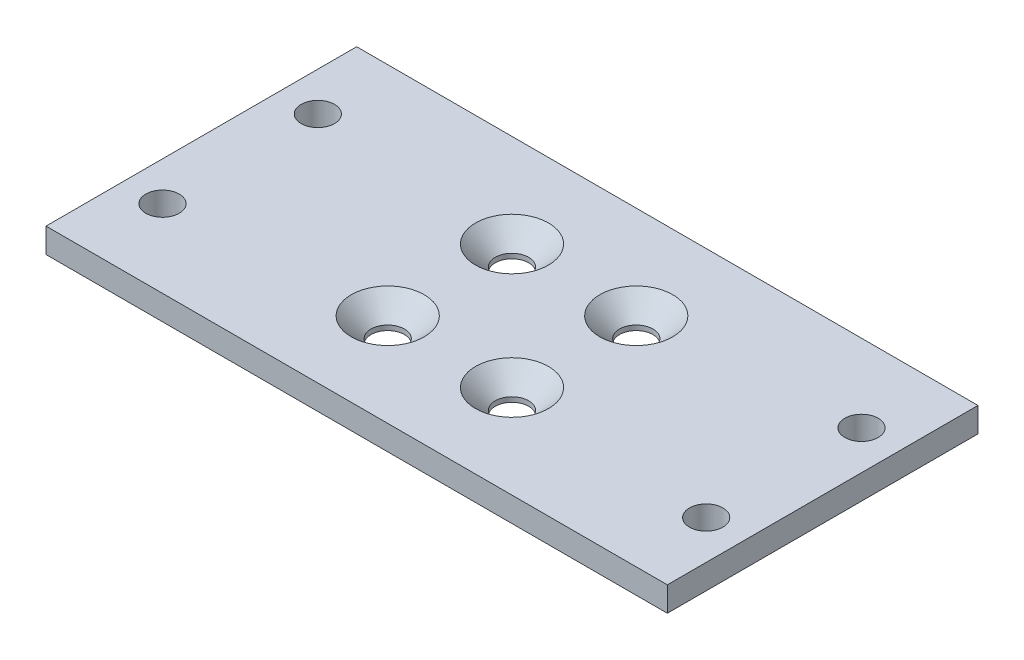
ISO-10303-21;
HEADER;
FILE_DESCRIPTION(('STEP AP214'),'2;1');
FILE_NAME('part.step','',(''),(''),'','','');
FILE_SCHEMA(('AUTOMOTIVE_DESIGN { 1 0 10303 214 1 1 1 1 }'));
ENDSEC;
DATA;
#1=APPLICATION_CONTEXT('core data for automotive mechanical design processes');
#2=APPLICATION_PROTOCOL_DEFINITION('international standard','automotive_design',2000,#1);
#3=PRODUCT_CONTEXT('',#1,'mechanical');
#4=PRODUCT('Part','Part','',(#3));
#5=PRODUCT_RELATED_PRODUCT_CATEGORY('part','',(#4));
#6=PRODUCT_DEFINITION_FORMATION('','',#4);
#7=PRODUCT_DEFINITION_CONTEXT('part definition',#1,'design');
#8=PRODUCT_DEFINITION('design','',#6,#7);
#9=PRODUCT_DEFINITION_SHAPE('','',#8);
#10=(LENGTH_UNIT() NAMED_UNIT(*) SI_UNIT(.MILLI.,.METRE.));
#11=(NAMED_UNIT(*) PLANE_ANGLE_UNIT() SI_UNIT($,.RADIAN.));
#12=(NAMED_UNIT(*) SI_UNIT($,.STERADIAN.) SOLID_ANGLE_UNIT());
#13=UNCERTAINTY_MEASURE_WITH_UNIT(LENGTH_MEASURE(1.E-05),#10,'distance_accuracy_value','');
#14=(GEOMETRIC_REPRESENTATION_CONTEXT(3) GLOBAL_UNCERTAINTY_ASSIGNED_CONTEXT((#13)) GLOBAL_UNIT_ASSIGNED_CONTEXT((#10,
#11,#12)) REPRESENTATION_CONTEXT('',''));
#15=CARTESIAN_POINT('',(0.,0.,0.));
#16=DIRECTION('',(0.,0.,1.));
#17=DIRECTION('',(1.,0.,0.));
#18=AXIS2_PLACEMENT_3D('',#15,#16,#17);
#19=CARTESIAN_POINT('',(0.,3.175,0.));
#20=DIRECTION('',(0.,-1.,0.));
#21=DIRECTION('',(0.,0.,-1.));
#22=AXIS2_PLACEMENT_3D('',#19,#20,#21);
#23=PLANE('',#22);
#24=CARTESIAN_POINT('',(-8.,3.175,-8.));
#25=DIRECTION('',(0.,1.,0.));
#26=DIRECTION('',(0.,0.,1.));
#27=AXIS2_PLACEMENT_3D('',#24,#25,#26);
#28=CIRCLE('',#27,4.7);
#29=CARTESIAN_POINT('',(-8.,3.175,-3.3));
#30=VERTEX_POINT('',#29);
#31=EDGE_CURVE('E174',#30,#30,#28,.T.);
#32=ORIENTED_EDGE('',*,*,#31,.F.);
#33=EDGE_LOOP('',(#32));
#34=FACE_BOUND('',#33,.T.);
#35=CARTESIAN_POINT('',(8.00000000000003,3.175,-7.99999999999997));
#36=DIRECTION('',(0.,1.,0.));
#37=DIRECTION('',(0.,0.,1.));
#38=AXIS2_PLACEMENT_3D('',#35,#36,#37);
#39=CIRCLE('',#38,4.7);
#40=CARTESIAN_POINT('',(8.00000000000003,3.175,-3.29999999999997));
#41=VERTEX_POINT('',#40);
#42=EDGE_CURVE('E165',#41,#41,#39,.T.);
#43=ORIENTED_EDGE('',*,*,#42,.F.);
#44=EDGE_LOOP('',(#43));
#45=FACE_BOUND('',#44,.T.);
#46=CARTESIAN_POINT('',(7.99999999999994,3.175,8.00000000000006));
#47=DIRECTION('',(0.,1.,0.));
#48=DIRECTION('',(0.,0.,1.));
#49=AXIS2_PLACEMENT_3D('',#46,#47,#48);
#50=CIRCLE('',#49,4.7);
#51=CARTESIAN_POINT('',(7.99999999999994,3.175,12.7000000000001));
#52=VERTEX_POINT('',#51);
#53=EDGE_CURVE('E156',#52,#52,#50,.T.);
#54=ORIENTED_EDGE('',*,*,#53,.F.);
#55=EDGE_LOOP('',(#54));
#56=FACE_BOUND('',#55,.T.);
#57=CARTESIAN_POINT('',(-8.00000000000008,3.175,7.99999999999992));
#58=DIRECTION('',(0.,1.,0.));
#59=DIRECTION('',(0.,0.,1.));
#60=AXIS2_PLACEMENT_3D('',#57,#58,#59);
#61=CIRCLE('',#60,4.7);
#62=CARTESIAN_POINT('',(-8.00000000000008,3.175,12.6999999999999));
#63=VERTEX_POINT('',#62);
#64=EDGE_CURVE('E147',#63,#63,#61,.T.);
#65=ORIENTED_EDGE('',*,*,#64,.F.);
#66=EDGE_LOOP('',(#65));
#67=FACE_BOUND('',#66,.T.);
#68=CARTESIAN_POINT('',(-35.,3.175,-10.));
#69=DIRECTION('',(0.,1.,0.));
#70=DIRECTION('',(0.,0.,1.));
#71=AXIS2_PLACEMENT_3D('',#68,#69,#70);
#72=CIRCLE('',#71,2.15);
#73=CARTESIAN_POINT('',(-35.,3.175,-7.85));
#74=VERTEX_POINT('',#73);
#75=EDGE_CURVE('E138',#74,#74,#72,.T.);
#76=ORIENTED_EDGE('',*,*,#75,.F.);
#77=EDGE_LOOP('',(#76));
#78=FACE_BOUND('',#77,.T.);
#79=CARTESIAN_POINT('',(35.,3.175,-9.99999999999998));
#80=DIRECTION('',(0.,1.,0.));
#81=DIRECTION('',(0.,0.,1.));
#82=AXIS2_PLACEMENT_3D('',#79,#80,#81);
#83=CIRCLE('',#82,2.15);
#84=CARTESIAN_POINT('',(35.,3.175,-7.84999999999998));
#85=VERTEX_POINT('',#84);
#86=EDGE_CURVE('E132',#85,#85,#83,.T.);
#87=ORIENTED_EDGE('',*,*,#86,.F.);
#88=EDGE_LOOP('',(#87));
#89=FACE_BOUND('',#88,.T.);
#90=CARTESIAN_POINT('',(-35.,3.175,10.));
#91=DIRECTION('',(0.,1.,0.));
#92=DIRECTION('',(0.,0.,1.));
#93=AXIS2_PLACEMENT_3D('',#90,#91,#92);
#94=CIRCLE('',#93,2.15);
#95=CARTESIAN_POINT('',(-35.,3.175,12.15));
#96=VERTEX_POINT('',#95);
#97=EDGE_CURVE('E120',#96,#96,#94,.T.);
#98=ORIENTED_EDGE('',*,*,#97,.F.);
#99=EDGE_LOOP('',(#98));
#100=FACE_BOUND('',#99,.T.);
#101=DIRECTION('',(0.,0.,-1.));
#102=VECTOR('',#101,1.);
#103=CARTESIAN_POINT('',(40.,3.175,20.));
#104=LINE('',#103,#102);
#105=CARTESIAN_POINT('',(40.,3.175,20.));
#106=VERTEX_POINT('',#105);
#107=CARTESIAN_POINT('',(40.,3.175,-20.));
#108=VERTEX_POINT('',#107);
#109=EDGE_CURVE('E91',#106,#108,#104,.T.);
#110=ORIENTED_EDGE('',*,*,#109,.T.);
#111=DIRECTION('',(-1.,0.,0.));
#112=VECTOR('',#111,1.);
#113=CARTESIAN_POINT('',(-40.,3.175,-20.));
#114=LINE('',#113,#112);
#115=CARTESIAN_POINT('',(-40.,3.175,-20.));
#116=VERTEX_POINT('',#115);
#117=EDGE_CURVE('E86',#108,#116,#114,.T.);
#118=ORIENTED_EDGE('',*,*,#117,.T.);
#119=DIRECTION('',(0.,0.,1.));
#120=VECTOR('',#119,1.);
#121=CARTESIAN_POINT('',(-40.,3.175,20.));
#122=LINE('',#121,#120);
#123=CARTESIAN_POINT('',(-40.,3.175,20.));
#124=VERTEX_POINT('',#123);
#125=EDGE_CURVE('E89',#116,#124,#122,.T.);
#126=ORIENTED_EDGE('',*,*,#125,.T.);
#127=DIRECTION('',(1.,0.,0.));
#128=VECTOR('',#127,1.);
#129=CARTESIAN_POINT('',(-40.,3.175,20.));
#130=LINE('',#129,#128);
#131=EDGE_CURVE('E56',#124,#106,#130,.T.);
#132=ORIENTED_EDGE('',*,*,#131,.T.);
#133=EDGE_LOOP('',(#110,#118,#126,#132));
#134=FACE_BOUND('',#133,.T.);
#135=CARTESIAN_POINT('',(35.,3.175,9.99999999999998));
#136=DIRECTION('',(0.,1.,0.));
#137=DIRECTION('',(0.,0.,1.));
#138=AXIS2_PLACEMENT_3D('',#135,#136,#137);
#139=CIRCLE('',#138,2.15);
#140=CARTESIAN_POINT('',(35.,3.175,12.15));
#141=VERTEX_POINT('',#140);
#142=EDGE_CURVE('E126',#141,#141,#139,.T.);
#143=ORIENTED_EDGE('',*,*,#142,.F.);
#144=EDGE_LOOP('',(#143));
#145=FACE_BOUND('',#144,.T.);
#146=ADVANCED_FACE('F39',(#34,#45,#56,#67,#78,#89,#100,#134,#145),#23,.F.);
#147=CARTESIAN_POINT('',(0.,0.,0.));
#148=DIRECTION('',(0.,-1.,0.));
#149=DIRECTION('',(0.,0.,-1.));
#150=AXIS2_PLACEMENT_3D('',#147,#148,#149);
#151=PLANE('',#150);
#152=CARTESIAN_POINT('',(-8.,0.,-8.));
#153=DIRECTION('',(0.,1.,0.));
#154=DIRECTION('',(0.,0.,1.));
#155=AXIS2_PLACEMENT_3D('',#152,#153,#154);
#156=CIRCLE('',#155,2.15);
#157=CARTESIAN_POINT('',(-8.,0.,-5.85));
#158=VERTEX_POINT('',#157);
#159=EDGE_CURVE('E168',#158,#158,#156,.T.);
#160=ORIENTED_EDGE('',*,*,#159,.T.);
#161=EDGE_LOOP('',(#160));
#162=FACE_BOUND('',#161,.T.);
#163=CARTESIAN_POINT('',(8.00000000000003,0.,-7.99999999999997));
#164=DIRECTION('',(0.,1.,0.));
#165=DIRECTION('',(0.,0.,1.));
#166=AXIS2_PLACEMENT_3D('',#163,#164,#165);
#167=CIRCLE('',#166,2.15);
#168=CARTESIAN_POINT('',(8.00000000000003,0.,-5.84999999999997));
#169=VERTEX_POINT('',#168);
#170=EDGE_CURVE('E159',#169,#169,#167,.T.);
#171=ORIENTED_EDGE('',*,*,#170,.T.);
#172=EDGE_LOOP('',(#171));
#173=FACE_BOUND('',#172,.T.);
#174=CARTESIAN_POINT('',(7.99999999999994,0.,8.00000000000006));
#175=DIRECTION('',(0.,1.,0.));
#176=DIRECTION('',(0.,0.,1.));
#177=AXIS2_PLACEMENT_3D('',#174,#175,#176);
#178=CIRCLE('',#177,2.15);
#179=CARTESIAN_POINT('',(7.99999999999994,0.,10.1500000000001));
#180=VERTEX_POINT('',#179);
#181=EDGE_CURVE('E150',#180,#180,#178,.T.);
#182=ORIENTED_EDGE('',*,*,#181,.T.);
#183=EDGE_LOOP('',(#182));
#184=FACE_BOUND('',#183,.T.);
#185=CARTESIAN_POINT('',(-8.00000000000008,0.,7.99999999999992));
#186=DIRECTION('',(0.,1.,0.));
#187=DIRECTION('',(0.,0.,1.));
#188=AXIS2_PLACEMENT_3D('',#185,#186,#187);
#189=CIRCLE('',#188,2.15);
#190=CARTESIAN_POINT('',(-8.00000000000008,0.,10.1499999999999));
#191=VERTEX_POINT('',#190);
#192=EDGE_CURVE('E141',#191,#191,#189,.T.);
#193=ORIENTED_EDGE('',*,*,#192,.T.);
#194=EDGE_LOOP('',(#193));
#195=FACE_BOUND('',#194,.T.);
#196=CARTESIAN_POINT('',(-35.,0.,-10.));
#197=DIRECTION('',(0.,1.,0.));
#198=DIRECTION('',(0.,0.,1.));
#199=AXIS2_PLACEMENT_3D('',#196,#197,#198);
#200=CIRCLE('',#199,2.15);
#201=CARTESIAN_POINT('',(-35.,0.,-7.85));
#202=VERTEX_POINT('',#201);
#203=EDGE_CURVE('E135',#202,#202,#200,.T.);
#204=ORIENTED_EDGE('',*,*,#203,.T.);
#205=EDGE_LOOP('',(#204));
#206=FACE_BOUND('',#205,.T.);
#207=CARTESIAN_POINT('',(35.,0.,-9.99999999999998));
#208=DIRECTION('',(0.,1.,0.));
#209=DIRECTION('',(0.,0.,1.));
#210=AXIS2_PLACEMENT_3D('',#207,#208,#209);
#211=CIRCLE('',#210,2.15);
#212=CARTESIAN_POINT('',(35.,0.,-7.84999999999998));
#213=VERTEX_POINT('',#212);
#214=EDGE_CURVE('E129',#213,#213,#211,.T.);
#215=ORIENTED_EDGE('',*,*,#214,.T.);
#216=EDGE_LOOP('',(#215));
#217=FACE_BOUND('',#216,.T.);
#218=CARTESIAN_POINT('',(35.,0.,9.99999999999998));
#219=DIRECTION('',(0.,1.,0.));
#220=DIRECTION('',(0.,0.,1.));
#221=AXIS2_PLACEMENT_3D('',#218,#219,#220);
#222=CIRCLE('',#221,2.15);
#223=CARTESIAN_POINT('',(35.,0.,12.15));
#224=VERTEX_POINT('',#223);
#225=EDGE_CURVE('E123',#224,#224,#222,.T.);
#226=ORIENTED_EDGE('',*,*,#225,.T.);
#227=EDGE_LOOP('',(#226));
#228=FACE_BOUND('',#227,.T.);
#229=DIRECTION('',(0.,0.,-1.));
#230=VECTOR('',#229,1.);
#231=CARTESIAN_POINT('',(40.,0.,20.));
#232=LINE('',#231,#230);
#233=CARTESIAN_POINT('',(40.,0.,20.));
#234=VERTEX_POINT('',#233);
#235=CARTESIAN_POINT('',(40.,0.,-20.));
#236=VERTEX_POINT('',#235);
#237=EDGE_CURVE('E103',#234,#236,#232,.T.);
#238=ORIENTED_EDGE('',*,*,#237,.F.);
#239=DIRECTION('',(1.,0.,0.));
#240=VECTOR('',#239,1.);
#241=CARTESIAN_POINT('',(-40.,0.,20.));
#242=LINE('',#241,#240);
#243=CARTESIAN_POINT('',(-40.,0.,20.));
#244=VERTEX_POINT('',#243);
#245=EDGE_CURVE('E79',#244,#234,#242,.T.);
#246=ORIENTED_EDGE('',*,*,#245,.F.);
#247=DIRECTION('',(0.,0.,1.));
#248=VECTOR('',#247,1.);
#249=CARTESIAN_POINT('',(-40.,0.,20.));
#250=LINE('',#249,#248);
#251=CARTESIAN_POINT('',(-40.,0.,-20.));
#252=VERTEX_POINT('',#251);
#253=EDGE_CURVE('E73',#252,#244,#250,.T.);
#254=ORIENTED_EDGE('',*,*,#253,.F.);
#255=DIRECTION('',(-1.,0.,0.));
#256=VECTOR('',#255,1.);
#257=CARTESIAN_POINT('',(-40.,0.,-20.));
#258=LINE('',#257,#256);
#259=EDGE_CURVE('E95',#236,#252,#258,.T.);
#260=ORIENTED_EDGE('',*,*,#259,.F.);
#261=EDGE_LOOP('',(#238,#246,#254,#260));
#262=FACE_BOUND('',#261,.T.);
#263=CARTESIAN_POINT('',(-35.,0.,10.));
#264=DIRECTION('',(0.,1.,0.));
#265=DIRECTION('',(0.,0.,1.));
#266=AXIS2_PLACEMENT_3D('',#263,#264,#265);
#267=CIRCLE('',#266,2.15);
#268=CARTESIAN_POINT('',(-35.,0.,12.15));
#269=VERTEX_POINT('',#268);
#270=EDGE_CURVE('E106',#269,#269,#267,.T.);
#271=ORIENTED_EDGE('',*,*,#270,.T.);
#272=EDGE_LOOP('',(#271));
#273=FACE_BOUND('',#272,.T.);
#274=ADVANCED_FACE('F114',(#162,#173,#184,#195,#206,#217,#228,#262,#273),#151,.T.);
#275=CARTESIAN_POINT('',(40.,3.175,20.));
#276=DIRECTION('',(-1.,0.,0.));
#277=DIRECTION('',(0.,0.,1.));
#278=AXIS2_PLACEMENT_3D('',#275,#276,#277);
#279=PLANE('',#278);
#280=ORIENTED_EDGE('',*,*,#237,.T.);
#281=DIRECTION('',(0.,-1.,0.));
#282=VECTOR('',#281,1.);
#283=CARTESIAN_POINT('',(40.,3.175,-20.));
#284=LINE('',#283,#282);
#285=EDGE_CURVE('E11',#108,#236,#284,.T.);
#286=ORIENTED_EDGE('',*,*,#285,.F.);
#287=ORIENTED_EDGE('',*,*,#109,.F.);
#288=DIRECTION('',(0.,-1.,0.));
#289=VECTOR('',#288,1.);
#290=CARTESIAN_POINT('',(40.,3.175,20.));
#291=LINE('',#290,#289);
#292=EDGE_CURVE('E99',#106,#234,#291,.T.);
#293=ORIENTED_EDGE('',*,*,#292,.T.);
#294=EDGE_LOOP('',(#280,#286,#287,#293));
#295=FACE_BOUND('',#294,.T.);
#296=ADVANCED_FACE('F41',(#295),#279,.F.);
#297=CARTESIAN_POINT('',(-40.,3.175,-20.));
#298=DIRECTION('',(0.,0.,1.));
#299=DIRECTION('',(1.,0.,0.));
#300=AXIS2_PLACEMENT_3D('',#297,#298,#299);
#301=PLANE('',#300);
#302=ORIENTED_EDGE('',*,*,#259,.T.);
#303=DIRECTION('',(0.,-1.,0.));
#304=VECTOR('',#303,1.);
#305=CARTESIAN_POINT('',(-40.,3.175,-20.));
#306=LINE('',#305,#304);
#307=EDGE_CURVE('E48',#116,#252,#306,.T.);
#308=ORIENTED_EDGE('',*,*,#307,.F.);
#309=ORIENTED_EDGE('',*,*,#117,.F.);
#310=ORIENTED_EDGE('',*,*,#285,.T.);
#311=EDGE_LOOP('',(#302,#308,#309,#310));
#312=FACE_BOUND('',#311,.T.);
#313=ADVANCED_FACE('F94',(#312),#301,.F.);
#314=CARTESIAN_POINT('',(-40.,3.175,20.));
#315=DIRECTION('',(1.,0.,0.));
#316=DIRECTION('',(0.,0.,-1.));
#317=AXIS2_PLACEMENT_3D('',#314,#315,#316);
#318=PLANE('',#317);
#319=ORIENTED_EDGE('',*,*,#253,.T.);
#320=DIRECTION('',(0.,-1.,0.));
#321=VECTOR('',#320,1.);
#322=CARTESIAN_POINT('',(-40.,3.175,20.));
#323=LINE('',#322,#321);
#324=EDGE_CURVE('E96',#124,#244,#323,.T.);
#325=ORIENTED_EDGE('',*,*,#324,.F.);
#326=ORIENTED_EDGE('',*,*,#125,.F.);
#327=ORIENTED_EDGE('',*,*,#307,.T.);
#328=EDGE_LOOP('',(#319,#325,#326,#327));
#329=FACE_BOUND('',#328,.T.);
#330=ADVANCED_FACE('F97',(#329),#318,.F.);
#331=CARTESIAN_POINT('',(-40.,3.175,20.));
#332=DIRECTION('',(0.,0.,-1.));
#333=DIRECTION('',(-1.,0.,0.));
#334=AXIS2_PLACEMENT_3D('',#331,#332,#333);
#335=PLANE('',#334);
#336=ORIENTED_EDGE('',*,*,#245,.T.);
#337=ORIENTED_EDGE('',*,*,#292,.F.);
#338=ORIENTED_EDGE('',*,*,#131,.F.);
#339=ORIENTED_EDGE('',*,*,#324,.T.);
#340=EDGE_LOOP('',(#336,#337,#338,#339));
#341=FACE_BOUND('',#340,.T.);
#342=ADVANCED_FACE('F111',(#341),#335,.F.);
#343=CARTESIAN_POINT('',(-35.,3.175,10.));
#344=DIRECTION('',(0.,1.,0.));
#345=DIRECTION('',(0.,0.,1.));
#346=AXIS2_PLACEMENT_3D('',#343,#344,#345);
#347=CYLINDRICAL_SURFACE('',#346,2.15);
#348=ORIENTED_EDGE('',*,*,#270,.F.);
#349=EDGE_LOOP('',(#348));
#350=FACE_BOUND('',#349,.T.);
#351=ORIENTED_EDGE('',*,*,#97,.T.);
#352=EDGE_LOOP('',(#351));
#353=FACE_BOUND('',#352,.T.);
#354=ADVANCED_FACE('F195',(#350,#353),#347,.F.);
#355=CARTESIAN_POINT('',(35.,3.175,9.99999999999998));
#356=DIRECTION('',(0.,1.,0.));
#357=DIRECTION('',(0.,0.,1.));
#358=AXIS2_PLACEMENT_3D('',#355,#356,#357);
#359=CYLINDRICAL_SURFACE('',#358,2.15);
#360=ORIENTED_EDGE('',*,*,#225,.F.);
#361=EDGE_LOOP('',(#360));
#362=FACE_BOUND('',#361,.T.);
#363=ORIENTED_EDGE('',*,*,#142,.T.);
#364=EDGE_LOOP('',(#363));
#365=FACE_BOUND('',#364,.T.);
#366=ADVANCED_FACE('F197',(#362,#365),#359,.F.);
#367=CARTESIAN_POINT('',(35.,3.175,-9.99999999999998));
#368=DIRECTION('',(0.,1.,0.));
#369=DIRECTION('',(0.,0.,1.));
#370=AXIS2_PLACEMENT_3D('',#367,#368,#369);
#371=CYLINDRICAL_SURFACE('',#370,2.15);
#372=ORIENTED_EDGE('',*,*,#214,.F.);
#373=EDGE_LOOP('',(#372));
#374=FACE_BOUND('',#373,.T.);
#375=ORIENTED_EDGE('',*,*,#86,.T.);
#376=EDGE_LOOP('',(#375));
#377=FACE_BOUND('',#376,.T.);
#378=ADVANCED_FACE('F204',(#374,#377),#371,.F.);
#379=CARTESIAN_POINT('',(-35.,3.175,-10.));
#380=DIRECTION('',(0.,1.,0.));
#381=DIRECTION('',(0.,0.,1.));
#382=AXIS2_PLACEMENT_3D('',#379,#380,#381);
#383=CYLINDRICAL_SURFACE('',#382,2.15);
#384=ORIENTED_EDGE('',*,*,#203,.F.);
#385=EDGE_LOOP('',(#384));
#386=FACE_BOUND('',#385,.T.);
#387=ORIENTED_EDGE('',*,*,#75,.T.);
#388=EDGE_LOOP('',(#387));
#389=FACE_BOUND('',#388,.T.);
#390=ADVANCED_FACE('F267',(#386,#389),#383,.F.);
#391=CARTESIAN_POINT('',(-8.00000000000008,3.175,7.99999999999992));
#392=DIRECTION('',(0.,1.,0.));
#393=DIRECTION('',(0.,0.,1.));
#394=AXIS2_PLACEMENT_3D('',#391,#392,#393);
#395=CYLINDRICAL_SURFACE('',#394,2.14999999999999);
#396=ORIENTED_EDGE('',*,*,#192,.F.);
#397=EDGE_LOOP('',(#396));
#398=FACE_BOUND('',#397,.T.);
#399=CARTESIAN_POINT('',(-8.00000000000008,0.624999999999989,7.99999999999992));
#400=DIRECTION('',(0.,1.,0.));
#401=DIRECTION('',(0.,0.,1.));
#402=AXIS2_PLACEMENT_3D('',#399,#400,#401);
#403=CIRCLE('',#402,2.14999999999999);
#404=CARTESIAN_POINT('',(-8.00000000000008,0.624999999999989,10.1499999999999));
#405=VERTEX_POINT('',#404);
#406=EDGE_CURVE('E144',#405,#405,#403,.T.);
#407=ORIENTED_EDGE('',*,*,#406,.T.);
#408=EDGE_LOOP('',(#407));
#409=FACE_BOUND('',#408,.T.);
#410=ADVANCED_FACE('F276',(#398,#409),#395,.F.);
#411=CARTESIAN_POINT('',(-8.00000000000008,3.175,7.99999999999992));
#412=DIRECTION('',(0.,1.,0.));
#413=DIRECTION('',(0.,0.,1.));
#414=AXIS2_PLACEMENT_3D('',#411,#412,#413);
#415=CONICAL_SURFACE('',#414,4.7,0.785398163397448);
#416=ORIENTED_EDGE('',*,*,#406,.F.);
#417=EDGE_LOOP('',(#416));
#418=FACE_BOUND('',#417,.T.);
#419=ORIENTED_EDGE('',*,*,#64,.T.);
#420=EDGE_LOOP('',(#419));
#421=FACE_BOUND('',#420,.T.);
#422=ADVANCED_FACE('F286',(#418,#421),#415,.F.);
#423=CARTESIAN_POINT('',(7.99999999999994,3.175,8.00000000000006));
#424=DIRECTION('',(0.,1.,0.));
#425=DIRECTION('',(0.,0.,1.));
#426=AXIS2_PLACEMENT_3D('',#423,#424,#425);
#427=CYLINDRICAL_SURFACE('',#426,2.14999999999999);
#428=ORIENTED_EDGE('',*,*,#181,.F.);
#429=EDGE_LOOP('',(#428));
#430=FACE_BOUND('',#429,.T.);
#431=CARTESIAN_POINT('',(7.99999999999994,0.624999999999989,8.00000000000006));
#432=DIRECTION('',(0.,1.,0.));
#433=DIRECTION('',(0.,0.,1.));
#434=AXIS2_PLACEMENT_3D('',#431,#432,#433);
#435=CIRCLE('',#434,2.14999999999999);
#436=CARTESIAN_POINT('',(7.99999999999994,0.624999999999989,10.15));
#437=VERTEX_POINT('',#436);
#438=EDGE_CURVE('E153',#437,#437,#435,.T.);
#439=ORIENTED_EDGE('',*,*,#438,.T.);
#440=EDGE_LOOP('',(#439));
#441=FACE_BOUND('',#440,.T.);
#442=ADVANCED_FACE('F296',(#430,#441),#427,.F.);
#443=CARTESIAN_POINT('',(7.99999999999994,3.175,8.00000000000006));
#444=DIRECTION('',(0.,1.,0.));
#445=DIRECTION('',(0.,0.,1.));
#446=AXIS2_PLACEMENT_3D('',#443,#444,#445);
#447=CONICAL_SURFACE('',#446,4.7,0.785398163397448);
#448=ORIENTED_EDGE('',*,*,#438,.F.);
#449=EDGE_LOOP('',(#448));
#450=FACE_BOUND('',#449,.T.);
#451=ORIENTED_EDGE('',*,*,#53,.T.);
#452=EDGE_LOOP('',(#451));
#453=FACE_BOUND('',#452,.T.);
#454=ADVANCED_FACE('F306',(#450,#453),#447,.F.);
#455=CARTESIAN_POINT('',(8.00000000000003,3.175,-7.99999999999997));
#456=DIRECTION('',(0.,1.,0.));
#457=DIRECTION('',(0.,0.,1.));
#458=AXIS2_PLACEMENT_3D('',#455,#456,#457);
#459=CYLINDRICAL_SURFACE('',#458,2.14999999999999);
#460=ORIENTED_EDGE('',*,*,#170,.F.);
#461=EDGE_LOOP('',(#460));
#462=FACE_BOUND('',#461,.T.);
#463=CARTESIAN_POINT('',(8.00000000000003,0.624999999999989,-7.99999999999997));
#464=DIRECTION('',(0.,1.,0.));
#465=DIRECTION('',(0.,0.,1.));
#466=AXIS2_PLACEMENT_3D('',#463,#464,#465);
#467=CIRCLE('',#466,2.14999999999999);
#468=CARTESIAN_POINT('',(8.00000000000003,0.624999999999989,-5.84999999999998));
#469=VERTEX_POINT('',#468);
#470=EDGE_CURVE('E162',#469,#469,#467,.T.);
#471=ORIENTED_EDGE('',*,*,#470,.T.);
#472=EDGE_LOOP('',(#471));
#473=FACE_BOUND('',#472,.T.);
#474=ADVANCED_FACE('F316',(#462,#473),#459,.F.);
#475=CARTESIAN_POINT('',(8.00000000000003,3.175,-7.99999999999997));
#476=DIRECTION('',(0.,1.,0.));
#477=DIRECTION('',(0.,0.,1.));
#478=AXIS2_PLACEMENT_3D('',#475,#476,#477);
#479=CONICAL_SURFACE('',#478,4.7,0.785398163397448);
#480=ORIENTED_EDGE('',*,*,#470,.F.);
#481=EDGE_LOOP('',(#480));
#482=FACE_BOUND('',#481,.T.);
#483=ORIENTED_EDGE('',*,*,#42,.T.);
#484=EDGE_LOOP('',(#483));
#485=FACE_BOUND('',#484,.T.);
#486=ADVANCED_FACE('F326',(#482,#485),#479,.F.);
#487=CARTESIAN_POINT('',(-8.,3.175,-8.));
#488=DIRECTION('',(0.,1.,0.));
#489=DIRECTION('',(0.,0.,1.));
#490=AXIS2_PLACEMENT_3D('',#487,#488,#489);
#491=CYLINDRICAL_SURFACE('',#490,2.14999999999999);
#492=ORIENTED_EDGE('',*,*,#159,.F.);
#493=EDGE_LOOP('',(#492));
#494=FACE_BOUND('',#493,.T.);
#495=CARTESIAN_POINT('',(-8.,0.624999999999989,-8.));
#496=DIRECTION('',(0.,1.,0.));
#497=DIRECTION('',(0.,0.,1.));
#498=AXIS2_PLACEMENT_3D('',#495,#496,#497);
#499=CIRCLE('',#498,2.14999999999999);
#500=CARTESIAN_POINT('',(-8.,0.624999999999989,-5.85000000000001));
#501=VERTEX_POINT('',#500);
#502=EDGE_CURVE('E171',#501,#501,#499,.T.);
#503=ORIENTED_EDGE('',*,*,#502,.T.);
#504=EDGE_LOOP('',(#503));
#505=FACE_BOUND('',#504,.T.);
#506=ADVANCED_FACE('F336',(#494,#505),#491,.F.);
#507=CARTESIAN_POINT('',(-8.,3.175,-8.));
#508=DIRECTION('',(0.,1.,0.));
#509=DIRECTION('',(0.,0.,1.));
#510=AXIS2_PLACEMENT_3D('',#507,#508,#509);
#511=CONICAL_SURFACE('',#510,4.7,0.785398163397448);
#512=ORIENTED_EDGE('',*,*,#502,.F.);
#513=EDGE_LOOP('',(#512));
#514=FACE_BOUND('',#513,.T.);
#515=ORIENTED_EDGE('',*,*,#31,.T.);
#516=EDGE_LOOP('',(#515));
#517=FACE_BOUND('',#516,.T.);
#518=ADVANCED_FACE('F178',(#514,#517),#511,.F.);
#519=CLOSED_SHELL('',(#146,#274,#296,#313,#330,#342,#354,#366,#378,#390,#410,#422,#442,#454,
#474,#486,#506,#518));
#520=MANIFOLD_SOLID_BREP('B2',#519);
#521=ADVANCED_BREP_SHAPE_REPRESENTATION('',(#18,#520),#14);
#522=SHAPE_DEFINITION_REPRESENTATION(#9,#521);
ENDSEC;
END-ISO-10303-21;
